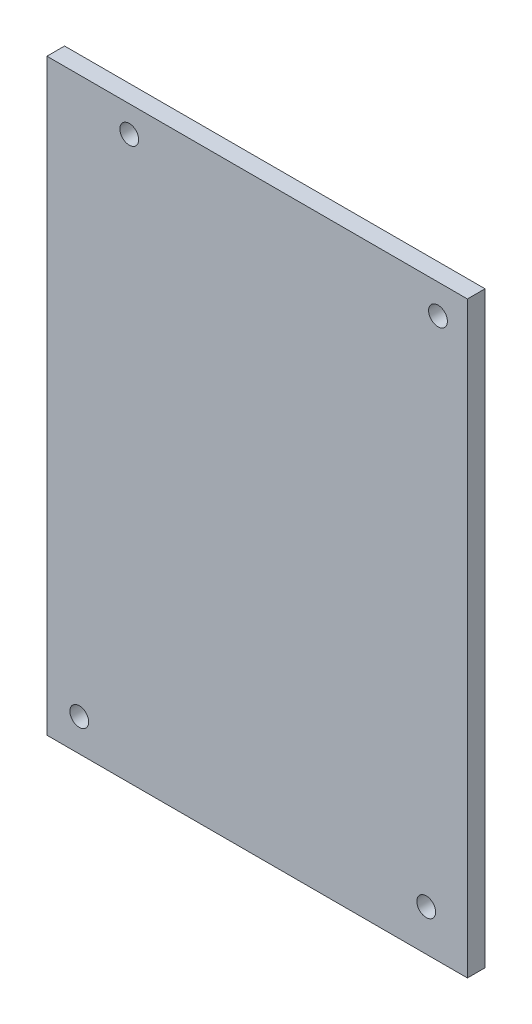
ISO-10303-21;
HEADER;
FILE_DESCRIPTION(('STEP AP214'),'2;1');
FILE_NAME('part.step','',(''),(''),'','','');
FILE_SCHEMA(('AUTOMOTIVE_DESIGN { 1 0 10303 214 1 1 1 1 }'));
ENDSEC;
DATA;
#1=APPLICATION_CONTEXT('core data for automotive mechanical design processes');
#2=APPLICATION_PROTOCOL_DEFINITION('international standard','automotive_design',2000,#1);
#3=PRODUCT_CONTEXT('',#1,'mechanical');
#4=PRODUCT('Part','Part','',(#3));
#5=PRODUCT_RELATED_PRODUCT_CATEGORY('part','',(#4));
#6=PRODUCT_DEFINITION_FORMATION('','',#4);
#7=PRODUCT_DEFINITION_CONTEXT('part definition',#1,'design');
#8=PRODUCT_DEFINITION('design','',#6,#7);
#9=PRODUCT_DEFINITION_SHAPE('','',#8);
#10=(LENGTH_UNIT() NAMED_UNIT(*) SI_UNIT(.MILLI.,.METRE.));
#11=(NAMED_UNIT(*) PLANE_ANGLE_UNIT() SI_UNIT($,.RADIAN.));
#12=(NAMED_UNIT(*) SI_UNIT($,.STERADIAN.) SOLID_ANGLE_UNIT());
#13=UNCERTAINTY_MEASURE_WITH_UNIT(LENGTH_MEASURE(1.E-05),#10,'distance_accuracy_value','');
#14=(GEOMETRIC_REPRESENTATION_CONTEXT(3) GLOBAL_UNCERTAINTY_ASSIGNED_CONTEXT((#13)) GLOBAL_UNIT_ASSIGNED_CONTEXT((#10,
#11,#12)) REPRESENTATION_CONTEXT('',''));
#15=CARTESIAN_POINT('',(0.,0.,0.));
#16=DIRECTION('',(0.,0.,1.));
#17=DIRECTION('',(1.,0.,0.));
#18=AXIS2_PLACEMENT_3D('',#15,#16,#17);
#19=CARTESIAN_POINT('',(0.,0.,3.));
#20=DIRECTION('',(0.,0.,1.));
#21=DIRECTION('',(1.,0.,0.));
#22=AXIS2_PLACEMENT_3D('',#19,#20,#21);
#23=PLANE('',#22);
#24=CARTESIAN_POINT('',(5.50000000000001,5.50000000000001,3.));
#25=DIRECTION('',(0.,0.,1.));
#26=DIRECTION('',(1.,0.,0.));
#27=AXIS2_PLACEMENT_3D('',#24,#25,#26);
#28=CIRCLE('',#27,1.60000000000001);
#29=CARTESIAN_POINT('',(7.10000000000002,5.50000000000001,3.));
#30=VERTEX_POINT('',#29);
#31=EDGE_CURVE('E127',#30,#30,#28,.T.);
#32=ORIENTED_EDGE('',*,*,#31,.F.);
#33=EDGE_LOOP('',(#32));
#34=FACE_BOUND('',#33,.T.);
#35=CARTESIAN_POINT('',(66.5,95.,3.));
#36=DIRECTION('',(0.,0.,1.));
#37=DIRECTION('',(1.,0.,0.));
#38=AXIS2_PLACEMENT_3D('',#35,#36,#37);
#39=CIRCLE('',#38,1.59999999999999);
#40=CARTESIAN_POINT('',(68.1,95.,3.));
#41=VERTEX_POINT('',#40);
#42=EDGE_CURVE('E106',#41,#41,#39,.T.);
#43=ORIENTED_EDGE('',*,*,#42,.F.);
#44=EDGE_LOOP('',(#43));
#45=FACE_BOUND('',#44,.T.);
#46=DIRECTION('',(0.,-1.,0.));
#47=VECTOR('',#46,1.);
#48=CARTESIAN_POINT('',(0.,100.,3.));
#49=LINE('',#48,#47);
#50=CARTESIAN_POINT('',(0.,100.,3.));
#51=VERTEX_POINT('',#50);
#52=CARTESIAN_POINT('',(0.,0.,3.));
#53=VERTEX_POINT('',#52);
#54=EDGE_CURVE('E91',#51,#53,#49,.T.);
#55=ORIENTED_EDGE('',*,*,#54,.T.);
#56=DIRECTION('',(1.,0.,0.));
#57=VECTOR('',#56,1.);
#58=CARTESIAN_POINT('',(0.,0.,3.));
#59=LINE('',#58,#57);
#60=CARTESIAN_POINT('',(71.5,0.,3.));
#61=VERTEX_POINT('',#60);
#62=EDGE_CURVE('E86',#53,#61,#59,.T.);
#63=ORIENTED_EDGE('',*,*,#62,.T.);
#64=DIRECTION('',(0.,1.,0.));
#65=VECTOR('',#64,1.);
#66=CARTESIAN_POINT('',(71.5,100.,3.));
#67=LINE('',#66,#65);
#68=CARTESIAN_POINT('',(71.5,100.,3.));
#69=VERTEX_POINT('',#68);
#70=EDGE_CURVE('E89',#61,#69,#67,.T.);
#71=ORIENTED_EDGE('',*,*,#70,.T.);
#72=DIRECTION('',(-1.,0.,0.));
#73=VECTOR('',#72,1.);
#74=CARTESIAN_POINT('',(0.,100.,3.));
#75=LINE('',#74,#73);
#76=EDGE_CURVE('E56',#69,#51,#75,.T.);
#77=ORIENTED_EDGE('',*,*,#76,.T.);
#78=EDGE_LOOP('',(#55,#63,#71,#77));
#79=FACE_BOUND('',#78,.T.);
#80=CARTESIAN_POINT('',(64.5,7.,3.));
#81=DIRECTION('',(0.,0.,1.));
#82=DIRECTION('',(1.,0.,0.));
#83=AXIS2_PLACEMENT_3D('',#80,#81,#82);
#84=CIRCLE('',#83,1.60000000000002);
#85=CARTESIAN_POINT('',(66.1,7.,3.));
#86=VERTEX_POINT('',#85);
#87=EDGE_CURVE('E121',#86,#86,#84,.T.);
#88=ORIENTED_EDGE('',*,*,#87,.F.);
#89=EDGE_LOOP('',(#88));
#90=FACE_BOUND('',#89,.T.);
#91=CARTESIAN_POINT('',(14.,95.5,3.));
#92=DIRECTION('',(0.,0.,1.));
#93=DIRECTION('',(1.,0.,0.));
#94=AXIS2_PLACEMENT_3D('',#91,#92,#93);
#95=CIRCLE('',#94,1.60000000000001);
#96=CARTESIAN_POINT('',(15.6,95.5,3.));
#97=VERTEX_POINT('',#96);
#98=EDGE_CURVE('E133',#97,#97,#95,.T.);
#99=ORIENTED_EDGE('',*,*,#98,.F.);
#100=EDGE_LOOP('',(#99));
#101=FACE_BOUND('',#100,.T.);
#102=ADVANCED_FACE('F39',(#34,#45,#79,#90,#101),#23,.T.);
#103=CARTESIAN_POINT('',(0.,0.,0.));
#104=DIRECTION('',(0.,0.,1.));
#105=DIRECTION('',(1.,0.,0.));
#106=AXIS2_PLACEMENT_3D('',#103,#104,#105);
#107=PLANE('',#106);
#108=DIRECTION('',(0.,-1.,0.));
#109=VECTOR('',#108,1.);
#110=CARTESIAN_POINT('',(0.,100.,0.));
#111=LINE('',#110,#109);
#112=CARTESIAN_POINT('',(0.,100.,0.));
#113=VERTEX_POINT('',#112);
#114=CARTESIAN_POINT('',(0.,0.,0.));
#115=VERTEX_POINT('',#114);
#116=EDGE_CURVE('E103',#113,#115,#111,.T.);
#117=ORIENTED_EDGE('',*,*,#116,.F.);
#118=DIRECTION('',(-1.,0.,0.));
#119=VECTOR('',#118,1.);
#120=CARTESIAN_POINT('',(0.,100.,0.));
#121=LINE('',#120,#119);
#122=CARTESIAN_POINT('',(71.5,100.,0.));
#123=VERTEX_POINT('',#122);
#124=EDGE_CURVE('E79',#123,#113,#121,.T.);
#125=ORIENTED_EDGE('',*,*,#124,.F.);
#126=DIRECTION('',(0.,1.,0.));
#127=VECTOR('',#126,1.);
#128=CARTESIAN_POINT('',(71.5,100.,0.));
#129=LINE('',#128,#127);
#130=CARTESIAN_POINT('',(71.5,0.,0.));
#131=VERTEX_POINT('',#130);
#132=EDGE_CURVE('E73',#131,#123,#129,.T.);
#133=ORIENTED_EDGE('',*,*,#132,.F.);
#134=DIRECTION('',(1.,0.,0.));
#135=VECTOR('',#134,1.);
#136=CARTESIAN_POINT('',(0.,0.,0.));
#137=LINE('',#136,#135);
#138=EDGE_CURVE('E95',#115,#131,#137,.T.);
#139=ORIENTED_EDGE('',*,*,#138,.F.);
#140=EDGE_LOOP('',(#117,#125,#133,#139));
#141=FACE_BOUND('',#140,.T.);
#142=CARTESIAN_POINT('',(66.5,95.,0.));
#143=DIRECTION('',(0.,0.,1.));
#144=DIRECTION('',(1.,0.,0.));
#145=AXIS2_PLACEMENT_3D('',#142,#143,#144);
#146=CIRCLE('',#145,1.59999999999999);
#147=CARTESIAN_POINT('',(68.1,95.,0.));
#148=VERTEX_POINT('',#147);
#149=EDGE_CURVE('E118',#148,#148,#146,.T.);
#150=ORIENTED_EDGE('',*,*,#149,.T.);
#151=EDGE_LOOP('',(#150));
#152=FACE_BOUND('',#151,.T.);
#153=CARTESIAN_POINT('',(64.5,7.,0.));
#154=DIRECTION('',(0.,0.,1.));
#155=DIRECTION('',(1.,0.,0.));
#156=AXIS2_PLACEMENT_3D('',#153,#154,#155);
#157=CIRCLE('',#156,1.60000000000002);
#158=CARTESIAN_POINT('',(66.1,7.,0.));
#159=VERTEX_POINT('',#158);
#160=EDGE_CURVE('E124',#159,#159,#157,.T.);
#161=ORIENTED_EDGE('',*,*,#160,.T.);
#162=EDGE_LOOP('',(#161));
#163=FACE_BOUND('',#162,.T.);
#164=CARTESIAN_POINT('',(5.50000000000001,5.50000000000001,0.));
#165=DIRECTION('',(0.,0.,1.));
#166=DIRECTION('',(1.,0.,0.));
#167=AXIS2_PLACEMENT_3D('',#164,#165,#166);
#168=CIRCLE('',#167,1.60000000000001);
#169=CARTESIAN_POINT('',(7.10000000000002,5.50000000000001,0.));
#170=VERTEX_POINT('',#169);
#171=EDGE_CURVE('E130',#170,#170,#168,.T.);
#172=ORIENTED_EDGE('',*,*,#171,.T.);
#173=EDGE_LOOP('',(#172));
#174=FACE_BOUND('',#173,.T.);
#175=CARTESIAN_POINT('',(14.,95.5,0.));
#176=DIRECTION('',(0.,0.,1.));
#177=DIRECTION('',(1.,0.,0.));
#178=AXIS2_PLACEMENT_3D('',#175,#176,#177);
#179=CIRCLE('',#178,1.60000000000001);
#180=CARTESIAN_POINT('',(15.6,95.5,0.));
#181=VERTEX_POINT('',#180);
#182=EDGE_CURVE('E136',#181,#181,#179,.T.);
#183=ORIENTED_EDGE('',*,*,#182,.T.);
#184=EDGE_LOOP('',(#183));
#185=FACE_BOUND('',#184,.T.);
#186=ADVANCED_FACE('F114',(#141,#152,#163,#174,#185),#107,.F.);
#187=CARTESIAN_POINT('',(0.,100.,3.));
#188=DIRECTION('',(1.,0.,0.));
#189=DIRECTION('',(0.,1.,0.));
#190=AXIS2_PLACEMENT_3D('',#187,#188,#189);
#191=PLANE('',#190);
#192=ORIENTED_EDGE('',*,*,#116,.T.);
#193=DIRECTION('',(0.,0.,-1.));
#194=VECTOR('',#193,1.);
#195=CARTESIAN_POINT('',(0.,0.,3.));
#196=LINE('',#195,#194);
#197=EDGE_CURVE('E11',#53,#115,#196,.T.);
#198=ORIENTED_EDGE('',*,*,#197,.F.);
#199=ORIENTED_EDGE('',*,*,#54,.F.);
#200=DIRECTION('',(0.,0.,-1.));
#201=VECTOR('',#200,1.);
#202=CARTESIAN_POINT('',(0.,100.,3.));
#203=LINE('',#202,#201);
#204=EDGE_CURVE('E99',#51,#113,#203,.T.);
#205=ORIENTED_EDGE('',*,*,#204,.T.);
#206=EDGE_LOOP('',(#192,#198,#199,#205));
#207=FACE_BOUND('',#206,.T.);
#208=ADVANCED_FACE('F41',(#207),#191,.F.);
#209=CARTESIAN_POINT('',(0.,0.,3.));
#210=DIRECTION('',(0.,1.,0.));
#211=DIRECTION('',(0.,0.,1.));
#212=AXIS2_PLACEMENT_3D('',#209,#210,#211);
#213=PLANE('',#212);
#214=ORIENTED_EDGE('',*,*,#138,.T.);
#215=DIRECTION('',(0.,0.,-1.));
#216=VECTOR('',#215,1.);
#217=CARTESIAN_POINT('',(71.5,0.,3.));
#218=LINE('',#217,#216);
#219=EDGE_CURVE('E48',#61,#131,#218,.T.);
#220=ORIENTED_EDGE('',*,*,#219,.F.);
#221=ORIENTED_EDGE('',*,*,#62,.F.);
#222=ORIENTED_EDGE('',*,*,#197,.T.);
#223=EDGE_LOOP('',(#214,#220,#221,#222));
#224=FACE_BOUND('',#223,.T.);
#225=ADVANCED_FACE('F94',(#224),#213,.F.);
#226=CARTESIAN_POINT('',(71.5,100.,3.));
#227=DIRECTION('',(-1.,0.,0.));
#228=DIRECTION('',(0.,-1.,0.));
#229=AXIS2_PLACEMENT_3D('',#226,#227,#228);
#230=PLANE('',#229);
#231=ORIENTED_EDGE('',*,*,#132,.T.);
#232=DIRECTION('',(0.,0.,-1.));
#233=VECTOR('',#232,1.);
#234=CARTESIAN_POINT('',(71.5,100.,3.));
#235=LINE('',#234,#233);
#236=EDGE_CURVE('E96',#69,#123,#235,.T.);
#237=ORIENTED_EDGE('',*,*,#236,.F.);
#238=ORIENTED_EDGE('',*,*,#70,.F.);
#239=ORIENTED_EDGE('',*,*,#219,.T.);
#240=EDGE_LOOP('',(#231,#237,#238,#239));
#241=FACE_BOUND('',#240,.T.);
#242=ADVANCED_FACE('F97',(#241),#230,.F.);
#243=CARTESIAN_POINT('',(0.,100.,3.));
#244=DIRECTION('',(0.,-1.,0.));
#245=DIRECTION('',(0.,0.,-1.));
#246=AXIS2_PLACEMENT_3D('',#243,#244,#245);
#247=PLANE('',#246);
#248=ORIENTED_EDGE('',*,*,#124,.T.);
#249=ORIENTED_EDGE('',*,*,#204,.F.);
#250=ORIENTED_EDGE('',*,*,#76,.F.);
#251=ORIENTED_EDGE('',*,*,#236,.T.);
#252=EDGE_LOOP('',(#248,#249,#250,#251));
#253=FACE_BOUND('',#252,.T.);
#254=ADVANCED_FACE('F111',(#253),#247,.F.);
#255=CARTESIAN_POINT('',(66.5,95.,3.));
#256=DIRECTION('',(0.,0.,-1.));
#257=DIRECTION('',(-1.,0.,0.));
#258=AXIS2_PLACEMENT_3D('',#255,#256,#257);
#259=CYLINDRICAL_SURFACE('',#258,1.59999999999999);
#260=ORIENTED_EDGE('',*,*,#42,.T.);
#261=EDGE_LOOP('',(#260));
#262=FACE_BOUND('',#261,.T.);
#263=ORIENTED_EDGE('',*,*,#149,.F.);
#264=EDGE_LOOP('',(#263));
#265=FACE_BOUND('',#264,.T.);
#266=ADVANCED_FACE('F155',(#262,#265),#259,.F.);
#267=CARTESIAN_POINT('',(64.5,7.,3.));
#268=DIRECTION('',(0.,0.,-1.));
#269=DIRECTION('',(-1.,0.,0.));
#270=AXIS2_PLACEMENT_3D('',#267,#268,#269);
#271=CYLINDRICAL_SURFACE('',#270,1.60000000000002);
#272=ORIENTED_EDGE('',*,*,#87,.T.);
#273=EDGE_LOOP('',(#272));
#274=FACE_BOUND('',#273,.T.);
#275=ORIENTED_EDGE('',*,*,#160,.F.);
#276=EDGE_LOOP('',(#275));
#277=FACE_BOUND('',#276,.T.);
#278=ADVANCED_FACE('F200',(#274,#277),#271,.F.);
#279=CARTESIAN_POINT('',(5.50000000000001,5.50000000000001,3.));
#280=DIRECTION('',(0.,0.,-1.));
#281=DIRECTION('',(-1.,0.,0.));
#282=AXIS2_PLACEMENT_3D('',#279,#280,#281);
#283=CYLINDRICAL_SURFACE('',#282,1.60000000000001);
#284=ORIENTED_EDGE('',*,*,#31,.T.);
#285=EDGE_LOOP('',(#284));
#286=FACE_BOUND('',#285,.T.);
#287=ORIENTED_EDGE('',*,*,#171,.F.);
#288=EDGE_LOOP('',(#287));
#289=FACE_BOUND('',#288,.T.);
#290=ADVANCED_FACE('F208',(#286,#289),#283,.F.);
#291=CARTESIAN_POINT('',(14.,95.5,3.));
#292=DIRECTION('',(0.,0.,-1.));
#293=DIRECTION('',(-1.,0.,0.));
#294=AXIS2_PLACEMENT_3D('',#291,#292,#293);
#295=CYLINDRICAL_SURFACE('',#294,1.60000000000001);
#296=ORIENTED_EDGE('',*,*,#98,.T.);
#297=EDGE_LOOP('',(#296));
#298=FACE_BOUND('',#297,.T.);
#299=ORIENTED_EDGE('',*,*,#182,.F.);
#300=EDGE_LOOP('',(#299));
#301=FACE_BOUND('',#300,.T.);
#302=ADVANCED_FACE('F142',(#298,#301),#295,.F.);
#303=CLOSED_SHELL('',(#102,#186,#208,#225,#242,#254,#266,#278,#290,#302));
#304=MANIFOLD_SOLID_BREP('B2',#303);
#305=ADVANCED_BREP_SHAPE_REPRESENTATION('',(#18,#304),#14);
#306=SHAPE_DEFINITION_REPRESENTATION(#9,#305);
ENDSEC;
END-ISO-10303-21;
